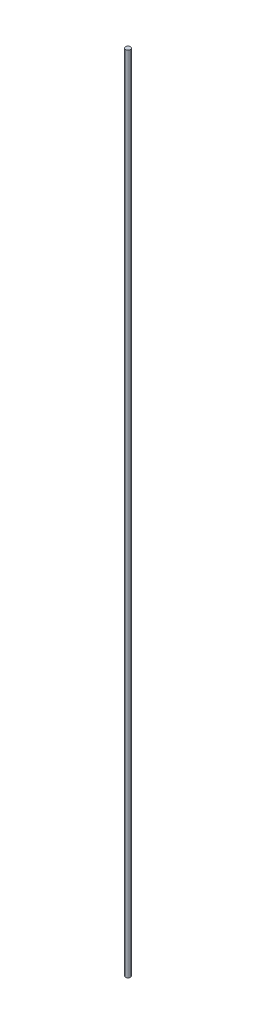
ISO-10303-21;
HEADER;
FILE_DESCRIPTION(('STEP AP214'),'2;1');
FILE_NAME('part.step','',(''),(''),'','','');
FILE_SCHEMA(('AUTOMOTIVE_DESIGN { 1 0 10303 214 1 1 1 1 }'));
ENDSEC;
DATA;
#1=APPLICATION_CONTEXT('core data for automotive mechanical design processes');
#2=APPLICATION_PROTOCOL_DEFINITION('international standard','automotive_design',2000,#1);
#3=PRODUCT_CONTEXT('',#1,'mechanical');
#4=PRODUCT('Part','Part','',(#3));
#5=PRODUCT_RELATED_PRODUCT_CATEGORY('part','',(#4));
#6=PRODUCT_DEFINITION_FORMATION('','',#4);
#7=PRODUCT_DEFINITION_CONTEXT('part definition',#1,'design');
#8=PRODUCT_DEFINITION('design','',#6,#7);
#9=PRODUCT_DEFINITION_SHAPE('','',#8);
#10=(LENGTH_UNIT() NAMED_UNIT(*) SI_UNIT(.MILLI.,.METRE.));
#11=(NAMED_UNIT(*) PLANE_ANGLE_UNIT() SI_UNIT($,.RADIAN.));
#12=(NAMED_UNIT(*) SI_UNIT($,.STERADIAN.) SOLID_ANGLE_UNIT());
#13=UNCERTAINTY_MEASURE_WITH_UNIT(LENGTH_MEASURE(1.E-05),#10,'distance_accuracy_value','');
#14=(GEOMETRIC_REPRESENTATION_CONTEXT(3) GLOBAL_UNCERTAINTY_ASSIGNED_CONTEXT((#13)) GLOBAL_UNIT_ASSIGNED_CONTEXT((#10,
#11,#12)) REPRESENTATION_CONTEXT('',''));
#15=CARTESIAN_POINT('',(0.,0.,0.));
#16=DIRECTION('',(0.,0.,1.));
#17=DIRECTION('',(1.,0.,0.));
#18=AXIS2_PLACEMENT_3D('',#15,#16,#17);
#19=CARTESIAN_POINT('',(0.,162.,0.));
#20=DIRECTION('',(0.,-1.,0.));
#21=DIRECTION('',(0.,0.,-1.));
#22=AXIS2_PLACEMENT_3D('',#19,#20,#21);
#23=CYLINDRICAL_SURFACE('',#22,0.5);
#24=CARTESIAN_POINT('',(0.,162.,0.));
#25=DIRECTION('',(0.,1.,0.));
#26=DIRECTION('',(0.,0.,1.));
#27=AXIS2_PLACEMENT_3D('',#24,#25,#26);
#28=CIRCLE('',#27,0.5);
#29=CARTESIAN_POINT('',(0.,162.,0.5));
#30=VERTEX_POINT('',#29);
#31=EDGE_CURVE('E10',#30,#30,#28,.T.);
#32=ORIENTED_EDGE('',*,*,#31,.F.);
#33=EDGE_LOOP('',(#32));
#34=FACE_BOUND('',#33,.T.);
#35=CARTESIAN_POINT('',(0.,0.,0.));
#36=DIRECTION('',(0.,1.,0.));
#37=DIRECTION('',(0.,0.,1.));
#38=AXIS2_PLACEMENT_3D('',#35,#36,#37);
#39=CIRCLE('',#38,0.5);
#40=CARTESIAN_POINT('',(0.,0.,0.5));
#41=VERTEX_POINT('',#40);
#42=EDGE_CURVE('E40',#41,#41,#39,.T.);
#43=ORIENTED_EDGE('',*,*,#42,.T.);
#44=EDGE_LOOP('',(#43));
#45=FACE_BOUND('',#44,.T.);
#46=ADVANCED_FACE('F37',(#34,#45),#23,.T.);
#47=CARTESIAN_POINT('',(0.,162.,0.));
#48=DIRECTION('',(0.,1.,0.));
#49=DIRECTION('',(0.,0.,1.));
#50=AXIS2_PLACEMENT_3D('',#47,#48,#49);
#51=PLANE('',#50);
#52=ORIENTED_EDGE('',*,*,#31,.T.);
#53=EDGE_LOOP('',(#52));
#54=FACE_BOUND('',#53,.T.);
#55=ADVANCED_FACE('F52',(#54),#51,.T.);
#56=CARTESIAN_POINT('',(0.,0.,0.));
#57=DIRECTION('',(0.,1.,0.));
#58=DIRECTION('',(0.,0.,1.));
#59=AXIS2_PLACEMENT_3D('',#56,#57,#58);
#60=PLANE('',#59);
#61=ORIENTED_EDGE('',*,*,#42,.F.);
#62=EDGE_LOOP('',(#61));
#63=FACE_BOUND('',#62,.T.);
#64=ADVANCED_FACE('F50',(#63),#60,.F.);
#65=CLOSED_SHELL('',(#46,#55,#64));
#66=MANIFOLD_SOLID_BREP('B2',#65);
#67=ADVANCED_BREP_SHAPE_REPRESENTATION('',(#18,#66),#14);
#68=SHAPE_DEFINITION_REPRESENTATION(#9,#67);
ENDSEC;
END-ISO-10303-21;
